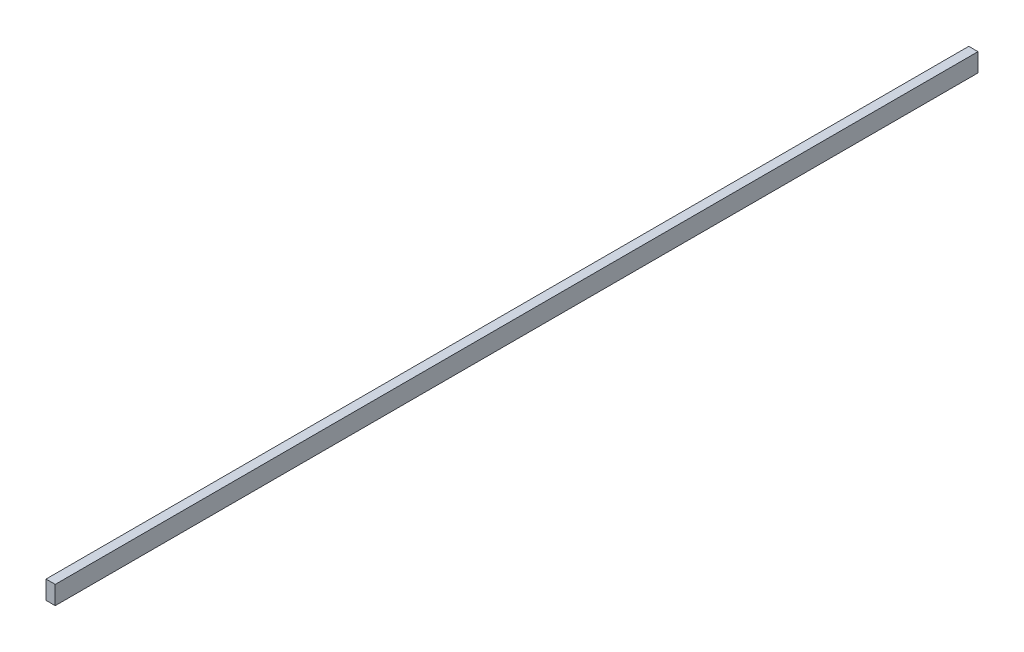
ISO-10303-21;
HEADER;
FILE_DESCRIPTION(('STEP AP214'),'2;1');
FILE_NAME('part.step','',(''),(''),'','','');
FILE_SCHEMA(('AUTOMOTIVE_DESIGN { 1 0 10303 214 1 1 1 1 }'));
ENDSEC;
DATA;
#1=APPLICATION_CONTEXT('core data for automotive mechanical design processes');
#2=APPLICATION_PROTOCOL_DEFINITION('international standard','automotive_design',2000,#1);
#3=PRODUCT_CONTEXT('',#1,'mechanical');
#4=PRODUCT('Part','Part','',(#3));
#5=PRODUCT_RELATED_PRODUCT_CATEGORY('part','',(#4));
#6=PRODUCT_DEFINITION_FORMATION('','',#4);
#7=PRODUCT_DEFINITION_CONTEXT('part definition',#1,'design');
#8=PRODUCT_DEFINITION('design','',#6,#7);
#9=PRODUCT_DEFINITION_SHAPE('','',#8);
#10=(LENGTH_UNIT() NAMED_UNIT(*) SI_UNIT(.MILLI.,.METRE.));
#11=(NAMED_UNIT(*) PLANE_ANGLE_UNIT() SI_UNIT($,.RADIAN.));
#12=(NAMED_UNIT(*) SI_UNIT($,.STERADIAN.) SOLID_ANGLE_UNIT());
#13=UNCERTAINTY_MEASURE_WITH_UNIT(LENGTH_MEASURE(1.E-05),#10,'distance_accuracy_value','');
#14=(GEOMETRIC_REPRESENTATION_CONTEXT(3) GLOBAL_UNCERTAINTY_ASSIGNED_CONTEXT((#13)) GLOBAL_UNIT_ASSIGNED_CONTEXT((#10,
#11,#12)) REPRESENTATION_CONTEXT('',''));
#15=CARTESIAN_POINT('',(0.,0.,0.));
#16=DIRECTION('',(0.,0.,1.));
#17=DIRECTION('',(1.,0.,0.));
#18=AXIS2_PLACEMENT_3D('',#15,#16,#17);
#19=CARTESIAN_POINT('',(5.,10.,500.));
#20=DIRECTION('',(0.,-1.,0.));
#21=DIRECTION('',(1.,0.,0.));
#22=AXIS2_PLACEMENT_3D('',#19,#20,#21);
#23=PLANE('',#22);
#24=DIRECTION('',(-1.,0.,0.));
#25=VECTOR('',#24,1.);
#26=CARTESIAN_POINT('',(5.,10.,0.));
#27=LINE('',#26,#25);
#28=CARTESIAN_POINT('',(5.,10.,0.));
#29=VERTEX_POINT('',#28);
#30=CARTESIAN_POINT('',(0.,10.,0.));
#31=VERTEX_POINT('',#30);
#32=EDGE_CURVE('E97',#29,#31,#27,.T.);
#33=ORIENTED_EDGE('',*,*,#32,.T.);
#34=DIRECTION('',(0.,0.,-1.));
#35=VECTOR('',#34,1.);
#36=CARTESIAN_POINT('',(0.,10.,500.));
#37=LINE('',#36,#35);
#38=CARTESIAN_POINT('',(0.,10.,500.));
#39=VERTEX_POINT('',#38);
#40=EDGE_CURVE('E11',#39,#31,#37,.T.);
#41=ORIENTED_EDGE('',*,*,#40,.F.);
#42=DIRECTION('',(-1.,0.,0.));
#43=VECTOR('',#42,1.);
#44=CARTESIAN_POINT('',(5.,10.,500.));
#45=LINE('',#44,#43);
#46=CARTESIAN_POINT('',(5.,10.,500.));
#47=VERTEX_POINT('',#46);
#48=EDGE_CURVE('E83',#47,#39,#45,.T.);
#49=ORIENTED_EDGE('',*,*,#48,.F.);
#50=DIRECTION('',(0.,0.,-1.));
#51=VECTOR('',#50,1.);
#52=CARTESIAN_POINT('',(5.,10.,500.));
#53=LINE('',#52,#51);
#54=EDGE_CURVE('E93',#47,#29,#53,.T.);
#55=ORIENTED_EDGE('',*,*,#54,.T.);
#56=EDGE_LOOP('',(#33,#41,#49,#55));
#57=FACE_BOUND('',#56,.T.);
#58=ADVANCED_FACE('F33',(#57),#23,.F.);
#59=CARTESIAN_POINT('',(0.,10.,500.));
#60=DIRECTION('',(1.,0.,0.));
#61=DIRECTION('',(0.,1.,0.));
#62=AXIS2_PLACEMENT_3D('',#59,#60,#61);
#63=PLANE('',#62);
#64=DIRECTION('',(0.,-1.,0.));
#65=VECTOR('',#64,1.);
#66=CARTESIAN_POINT('',(0.,10.,0.));
#67=LINE('',#66,#65);
#68=CARTESIAN_POINT('',(0.,0.,0.));
#69=VERTEX_POINT('',#68);
#70=EDGE_CURVE('E88',#31,#69,#67,.T.);
#71=ORIENTED_EDGE('',*,*,#70,.T.);
#72=DIRECTION('',(0.,0.,-1.));
#73=VECTOR('',#72,1.);
#74=CARTESIAN_POINT('',(0.,0.,500.));
#75=LINE('',#74,#73);
#76=CARTESIAN_POINT('',(0.,0.,500.));
#77=VERTEX_POINT('',#76);
#78=EDGE_CURVE('E41',#77,#69,#75,.T.);
#79=ORIENTED_EDGE('',*,*,#78,.F.);
#80=DIRECTION('',(0.,-1.,0.));
#81=VECTOR('',#80,1.);
#82=CARTESIAN_POINT('',(0.,10.,500.));
#83=LINE('',#82,#81);
#84=EDGE_CURVE('E77',#39,#77,#83,.T.);
#85=ORIENTED_EDGE('',*,*,#84,.F.);
#86=ORIENTED_EDGE('',*,*,#40,.T.);
#87=EDGE_LOOP('',(#71,#79,#85,#86));
#88=FACE_BOUND('',#87,.T.);
#89=ADVANCED_FACE('F87',(#88),#63,.F.);
#90=CARTESIAN_POINT('',(0.,0.,500.));
#91=DIRECTION('',(0.,1.,0.));
#92=DIRECTION('',(0.,0.,1.));
#93=AXIS2_PLACEMENT_3D('',#90,#91,#92);
#94=PLANE('',#93);
#95=DIRECTION('',(1.,0.,0.));
#96=VECTOR('',#95,1.);
#97=CARTESIAN_POINT('',(0.,0.,0.));
#98=LINE('',#97,#96);
#99=CARTESIAN_POINT('',(5.,0.,0.));
#100=VERTEX_POINT('',#99);
#101=EDGE_CURVE('E101',#69,#100,#98,.T.);
#102=ORIENTED_EDGE('',*,*,#101,.T.);
#103=DIRECTION('',(0.,0.,-1.));
#104=VECTOR('',#103,1.);
#105=CARTESIAN_POINT('',(5.,0.,500.));
#106=LINE('',#105,#104);
#107=CARTESIAN_POINT('',(5.,0.,500.));
#108=VERTEX_POINT('',#107);
#109=EDGE_CURVE('E90',#108,#100,#106,.T.);
#110=ORIENTED_EDGE('',*,*,#109,.F.);
#111=DIRECTION('',(1.,0.,0.));
#112=VECTOR('',#111,1.);
#113=CARTESIAN_POINT('',(0.,0.,500.));
#114=LINE('',#113,#112);
#115=EDGE_CURVE('E80',#77,#108,#114,.T.);
#116=ORIENTED_EDGE('',*,*,#115,.F.);
#117=ORIENTED_EDGE('',*,*,#78,.T.);
#118=EDGE_LOOP('',(#102,#110,#116,#117));
#119=FACE_BOUND('',#118,.T.);
#120=ADVANCED_FACE('F91',(#119),#94,.F.);
#121=CARTESIAN_POINT('',(5.,5.,500.));
#122=DIRECTION('',(-1.,0.,0.));
#123=DIRECTION('',(0.,0.,1.));
#124=AXIS2_PLACEMENT_3D('',#121,#122,#123);
#125=PLANE('',#124);
#126=DIRECTION('',(0.,1.,0.));
#127=VECTOR('',#126,1.);
#128=CARTESIAN_POINT('',(5.,5.,0.));
#129=LINE('',#128,#127);
#130=EDGE_CURVE('E66',#100,#29,#129,.T.);
#131=ORIENTED_EDGE('',*,*,#130,.T.);
#132=ORIENTED_EDGE('',*,*,#54,.F.);
#133=DIRECTION('',(0.,1.,0.));
#134=VECTOR('',#133,1.);
#135=CARTESIAN_POINT('',(5.,5.,500.));
#136=LINE('',#135,#134);
#137=EDGE_CURVE('E49',#108,#47,#136,.T.);
#138=ORIENTED_EDGE('',*,*,#137,.F.);
#139=ORIENTED_EDGE('',*,*,#109,.T.);
#140=EDGE_LOOP('',(#131,#132,#138,#139));
#141=FACE_BOUND('',#140,.T.);
#142=ADVANCED_FACE('F105',(#141),#125,.F.);
#143=CARTESIAN_POINT('',(0.,0.,500.));
#144=DIRECTION('',(0.,0.,1.));
#145=DIRECTION('',(1.,0.,0.));
#146=AXIS2_PLACEMENT_3D('',#143,#144,#145);
#147=PLANE('',#146);
#148=ORIENTED_EDGE('',*,*,#48,.T.);
#149=ORIENTED_EDGE('',*,*,#84,.T.);
#150=ORIENTED_EDGE('',*,*,#115,.T.);
#151=ORIENTED_EDGE('',*,*,#137,.T.);
#152=EDGE_LOOP('',(#148,#149,#150,#151));
#153=FACE_BOUND('',#152,.T.);
#154=ADVANCED_FACE('F78',(#153),#147,.T.);
#155=CARTESIAN_POINT('',(0.,0.,0.));
#156=DIRECTION('',(0.,0.,1.));
#157=DIRECTION('',(1.,0.,0.));
#158=AXIS2_PLACEMENT_3D('',#155,#156,#157);
#159=PLANE('',#158);
#160=ORIENTED_EDGE('',*,*,#32,.F.);
#161=ORIENTED_EDGE('',*,*,#130,.F.);
#162=ORIENTED_EDGE('',*,*,#101,.F.);
#163=ORIENTED_EDGE('',*,*,#70,.F.);
#164=EDGE_LOOP('',(#160,#161,#162,#163));
#165=FACE_BOUND('',#164,.T.);
#166=ADVANCED_FACE('F107',(#165),#159,.F.);
#167=CLOSED_SHELL('',(#58,#89,#120,#142,#154,#166));
#168=MANIFOLD_SOLID_BREP('B2',#167);
#169=ADVANCED_BREP_SHAPE_REPRESENTATION('',(#18,#168),#14);
#170=SHAPE_DEFINITION_REPRESENTATION(#9,#169);
ENDSEC;
END-ISO-10303-21;
